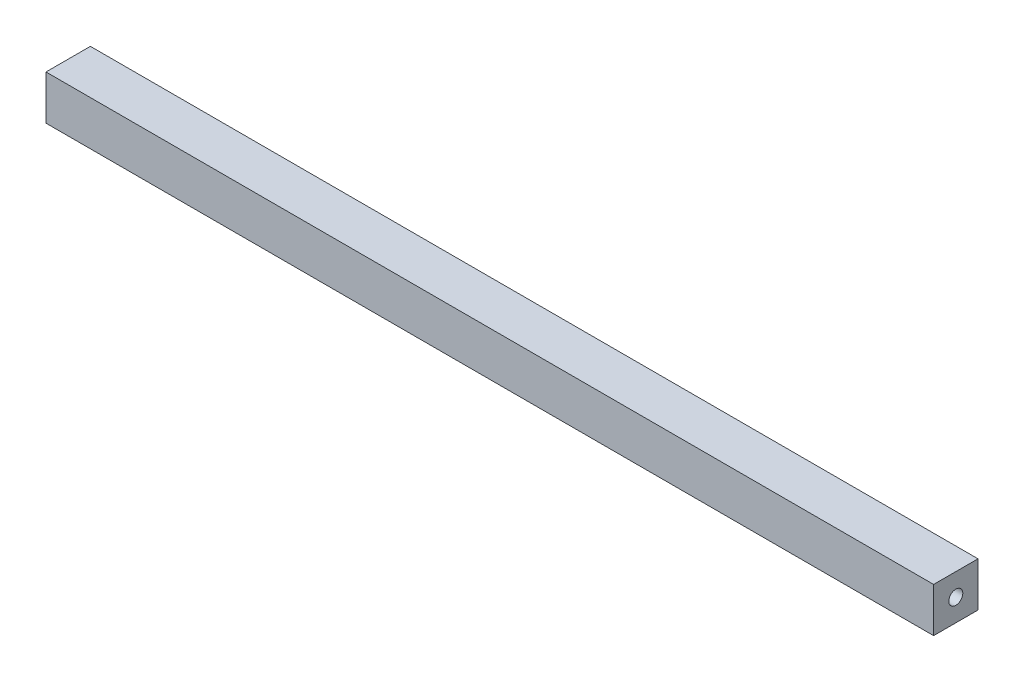
ISO-10303-21;
HEADER;
FILE_DESCRIPTION(('STEP AP214'),'2;1');
FILE_NAME('part.step','',(''),(''),'','','');
FILE_SCHEMA(('AUTOMOTIVE_DESIGN { 1 0 10303 214 1 1 1 1 }'));
ENDSEC;
DATA;
#1=APPLICATION_CONTEXT('core data for automotive mechanical design processes');
#2=APPLICATION_PROTOCOL_DEFINITION('international standard','automotive_design',2000,#1);
#3=PRODUCT_CONTEXT('',#1,'mechanical');
#4=PRODUCT('Part','Part','',(#3));
#5=PRODUCT_RELATED_PRODUCT_CATEGORY('part','',(#4));
#6=PRODUCT_DEFINITION_FORMATION('','',#4);
#7=PRODUCT_DEFINITION_CONTEXT('part definition',#1,'design');
#8=PRODUCT_DEFINITION('design','',#6,#7);
#9=PRODUCT_DEFINITION_SHAPE('','',#8);
#10=(LENGTH_UNIT() NAMED_UNIT(*) SI_UNIT(.MILLI.,.METRE.));
#11=(NAMED_UNIT(*) PLANE_ANGLE_UNIT() SI_UNIT($,.RADIAN.));
#12=(NAMED_UNIT(*) SI_UNIT($,.STERADIAN.) SOLID_ANGLE_UNIT());
#13=UNCERTAINTY_MEASURE_WITH_UNIT(LENGTH_MEASURE(1.E-05),#10,'distance_accuracy_value','');
#14=(GEOMETRIC_REPRESENTATION_CONTEXT(3) GLOBAL_UNCERTAINTY_ASSIGNED_CONTEXT((#13)) GLOBAL_UNIT_ASSIGNED_CONTEXT((#10,
#11,#12)) REPRESENTATION_CONTEXT('',''));
#15=CARTESIAN_POINT('',(0.,0.,0.));
#16=DIRECTION('',(0.,0.,1.));
#17=DIRECTION('',(1.,0.,0.));
#18=AXIS2_PLACEMENT_3D('',#15,#16,#17);
#19=CARTESIAN_POINT('',(254.,12.7,25.4));
#20=DIRECTION('',(-1.,0.,0.));
#21=DIRECTION('',(0.,0.,1.));
#22=AXIS2_PLACEMENT_3D('',#19,#20,#21);
#23=PLANE('',#22);
#24=CARTESIAN_POINT('',(254.,0.,12.7));
#25=DIRECTION('',(-1.,0.,0.));
#26=DIRECTION('',(0.,0.,1.));
#27=AXIS2_PLACEMENT_3D('',#24,#25,#26);
#28=CIRCLE('',#27,4.0005);
#29=CARTESIAN_POINT('',(254.,0.,16.7005));
#30=VERTEX_POINT('',#29);
#31=EDGE_CURVE('E99',#30,#30,#28,.T.);
#32=ORIENTED_EDGE('',*,*,#31,.T.);
#33=EDGE_LOOP('',(#32));
#34=FACE_BOUND('',#33,.T.);
#35=DIRECTION('',(0.,1.,0.));
#36=VECTOR('',#35,1.);
#37=CARTESIAN_POINT('',(254.,12.7,0.));
#38=LINE('',#37,#36);
#39=CARTESIAN_POINT('',(254.,-12.7,0.));
#40=VERTEX_POINT('',#39);
#41=CARTESIAN_POINT('',(254.,12.7,0.));
#42=VERTEX_POINT('',#41);
#43=EDGE_CURVE('E96',#40,#42,#38,.T.);
#44=ORIENTED_EDGE('',*,*,#43,.T.);
#45=DIRECTION('',(0.,0.,-1.));
#46=VECTOR('',#45,1.);
#47=CARTESIAN_POINT('',(254.,12.7,25.4));
#48=LINE('',#47,#46);
#49=CARTESIAN_POINT('',(254.,12.7,25.4));
#50=VERTEX_POINT('',#49);
#51=EDGE_CURVE('E11',#50,#42,#48,.T.);
#52=ORIENTED_EDGE('',*,*,#51,.F.);
#53=DIRECTION('',(0.,1.,0.));
#54=VECTOR('',#53,1.);
#55=CARTESIAN_POINT('',(254.,12.7,25.4));
#56=LINE('',#55,#54);
#57=CARTESIAN_POINT('',(254.,-12.7,25.4));
#58=VERTEX_POINT('',#57);
#59=EDGE_CURVE('E84',#58,#50,#56,.T.);
#60=ORIENTED_EDGE('',*,*,#59,.F.);
#61=DIRECTION('',(0.,0.,-1.));
#62=VECTOR('',#61,1.);
#63=CARTESIAN_POINT('',(254.,-12.7,25.4));
#64=LINE('',#63,#62);
#65=EDGE_CURVE('E92',#58,#40,#64,.T.);
#66=ORIENTED_EDGE('',*,*,#65,.T.);
#67=EDGE_LOOP('',(#44,#52,#60,#66));
#68=FACE_BOUND('',#67,.T.);
#69=ADVANCED_FACE('F33',(#34,#68),#23,.F.);
#70=CARTESIAN_POINT('',(-254.,12.7,25.4));
#71=DIRECTION('',(0.,-1.,0.));
#72=DIRECTION('',(0.,0.,-1.));
#73=AXIS2_PLACEMENT_3D('',#70,#71,#72);
#74=PLANE('',#73);
#75=DIRECTION('',(-1.,0.,0.));
#76=VECTOR('',#75,1.);
#77=CARTESIAN_POINT('',(-254.,12.7,0.));
#78=LINE('',#77,#76);
#79=CARTESIAN_POINT('',(-254.,12.7,0.));
#80=VERTEX_POINT('',#79);
#81=EDGE_CURVE('E88',#42,#80,#78,.T.);
#82=ORIENTED_EDGE('',*,*,#81,.T.);
#83=DIRECTION('',(0.,0.,-1.));
#84=VECTOR('',#83,1.);
#85=CARTESIAN_POINT('',(-254.,12.7,25.4));
#86=LINE('',#85,#84);
#87=CARTESIAN_POINT('',(-254.,12.7,25.4));
#88=VERTEX_POINT('',#87);
#89=EDGE_CURVE('E41',#88,#80,#86,.T.);
#90=ORIENTED_EDGE('',*,*,#89,.F.);
#91=DIRECTION('',(-1.,0.,0.));
#92=VECTOR('',#91,1.);
#93=CARTESIAN_POINT('',(-254.,12.7,25.4));
#94=LINE('',#93,#92);
#95=EDGE_CURVE('E79',#50,#88,#94,.T.);
#96=ORIENTED_EDGE('',*,*,#95,.F.);
#97=ORIENTED_EDGE('',*,*,#51,.T.);
#98=EDGE_LOOP('',(#82,#90,#96,#97));
#99=FACE_BOUND('',#98,.T.);
#100=ADVANCED_FACE('F87',(#99),#74,.F.);
#101=CARTESIAN_POINT('',(-254.,12.7,25.4));
#102=DIRECTION('',(1.,0.,0.));
#103=DIRECTION('',(0.,0.,-1.));
#104=AXIS2_PLACEMENT_3D('',#101,#102,#103);
#105=PLANE('',#104);
#106=CARTESIAN_POINT('',(-254.,0.,12.7));
#107=DIRECTION('',(-1.,0.,0.));
#108=DIRECTION('',(0.,0.,1.));
#109=AXIS2_PLACEMENT_3D('',#106,#107,#108);
#110=CIRCLE('',#109,4.0005);
#111=CARTESIAN_POINT('',(-254.,0.,16.7005));
#112=VERTEX_POINT('',#111);
#113=EDGE_CURVE('E110',#112,#112,#110,.T.);
#114=ORIENTED_EDGE('',*,*,#113,.F.);
#115=EDGE_LOOP('',(#114));
#116=FACE_BOUND('',#115,.T.);
#117=DIRECTION('',(0.,-1.,0.));
#118=VECTOR('',#117,1.);
#119=CARTESIAN_POINT('',(-254.,12.7,0.));
#120=LINE('',#119,#118);
#121=CARTESIAN_POINT('',(-254.,-12.7,0.));
#122=VERTEX_POINT('',#121);
#123=EDGE_CURVE('E66',#80,#122,#120,.T.);
#124=ORIENTED_EDGE('',*,*,#123,.T.);
#125=DIRECTION('',(0.,0.,-1.));
#126=VECTOR('',#125,1.);
#127=CARTESIAN_POINT('',(-254.,-12.7,25.4));
#128=LINE('',#127,#126);
#129=CARTESIAN_POINT('',(-254.,-12.7,25.4));
#130=VERTEX_POINT('',#129);
#131=EDGE_CURVE('E89',#130,#122,#128,.T.);
#132=ORIENTED_EDGE('',*,*,#131,.F.);
#133=DIRECTION('',(0.,-1.,0.));
#134=VECTOR('',#133,1.);
#135=CARTESIAN_POINT('',(-254.,12.7,25.4));
#136=LINE('',#135,#134);
#137=EDGE_CURVE('E82',#88,#130,#136,.T.);
#138=ORIENTED_EDGE('',*,*,#137,.F.);
#139=ORIENTED_EDGE('',*,*,#89,.T.);
#140=EDGE_LOOP('',(#124,#132,#138,#139));
#141=FACE_BOUND('',#140,.T.);
#142=ADVANCED_FACE('F90',(#116,#141),#105,.F.);
#143=CARTESIAN_POINT('',(-254.,-12.7,25.4));
#144=DIRECTION('',(0.,1.,0.));
#145=DIRECTION('',(0.,0.,1.));
#146=AXIS2_PLACEMENT_3D('',#143,#144,#145);
#147=PLANE('',#146);
#148=DIRECTION('',(1.,0.,0.));
#149=VECTOR('',#148,1.);
#150=CARTESIAN_POINT('',(-254.,-12.7,0.));
#151=LINE('',#150,#149);
#152=EDGE_CURVE('E72',#122,#40,#151,.T.);
#153=ORIENTED_EDGE('',*,*,#152,.T.);
#154=ORIENTED_EDGE('',*,*,#65,.F.);
#155=DIRECTION('',(1.,0.,0.));
#156=VECTOR('',#155,1.);
#157=CARTESIAN_POINT('',(-254.,-12.7,25.4));
#158=LINE('',#157,#156);
#159=EDGE_CURVE('E49',#130,#58,#158,.T.);
#160=ORIENTED_EDGE('',*,*,#159,.F.);
#161=ORIENTED_EDGE('',*,*,#131,.T.);
#162=EDGE_LOOP('',(#153,#154,#160,#161));
#163=FACE_BOUND('',#162,.T.);
#164=ADVANCED_FACE('F104',(#163),#147,.F.);
#165=CARTESIAN_POINT('',(0.,0.,25.4));
#166=DIRECTION('',(0.,0.,1.));
#167=DIRECTION('',(1.,0.,0.));
#168=AXIS2_PLACEMENT_3D('',#165,#166,#167);
#169=PLANE('',#168);
#170=ORIENTED_EDGE('',*,*,#59,.T.);
#171=ORIENTED_EDGE('',*,*,#95,.T.);
#172=ORIENTED_EDGE('',*,*,#137,.T.);
#173=ORIENTED_EDGE('',*,*,#159,.T.);
#174=EDGE_LOOP('',(#170,#171,#172,#173));
#175=FACE_BOUND('',#174,.T.);
#176=ADVANCED_FACE('F80',(#175),#169,.T.);
#177=CARTESIAN_POINT('',(0.,0.,0.));
#178=DIRECTION('',(0.,0.,1.));
#179=DIRECTION('',(1.,0.,0.));
#180=AXIS2_PLACEMENT_3D('',#177,#178,#179);
#181=PLANE('',#180);
#182=ORIENTED_EDGE('',*,*,#43,.F.);
#183=ORIENTED_EDGE('',*,*,#152,.F.);
#184=ORIENTED_EDGE('',*,*,#123,.F.);
#185=ORIENTED_EDGE('',*,*,#81,.F.);
#186=EDGE_LOOP('',(#182,#183,#184,#185));
#187=FACE_BOUND('',#186,.T.);
#188=ADVANCED_FACE('F107',(#187),#181,.F.);
#189=CARTESIAN_POINT('',(254.,0.,12.7));
#190=DIRECTION('',(-1.,0.,0.));
#191=DIRECTION('',(0.,0.,1.));
#192=AXIS2_PLACEMENT_3D('',#189,#190,#191);
#193=CYLINDRICAL_SURFACE('',#192,4.0005);
#194=ORIENTED_EDGE('',*,*,#31,.F.);
#195=EDGE_LOOP('',(#194));
#196=FACE_BOUND('',#195,.T.);
#197=ORIENTED_EDGE('',*,*,#113,.T.);
#198=EDGE_LOOP('',(#197));
#199=FACE_BOUND('',#198,.T.);
#200=ADVANCED_FACE('F117',(#196,#199),#193,.F.);
#201=CLOSED_SHELL('',(#69,#100,#142,#164,#176,#188,#200));
#202=MANIFOLD_SOLID_BREP('B2',#201);
#203=ADVANCED_BREP_SHAPE_REPRESENTATION('',(#18,#202),#14);
#204=SHAPE_DEFINITION_REPRESENTATION(#9,#203);
ENDSEC;
END-ISO-10303-21;
